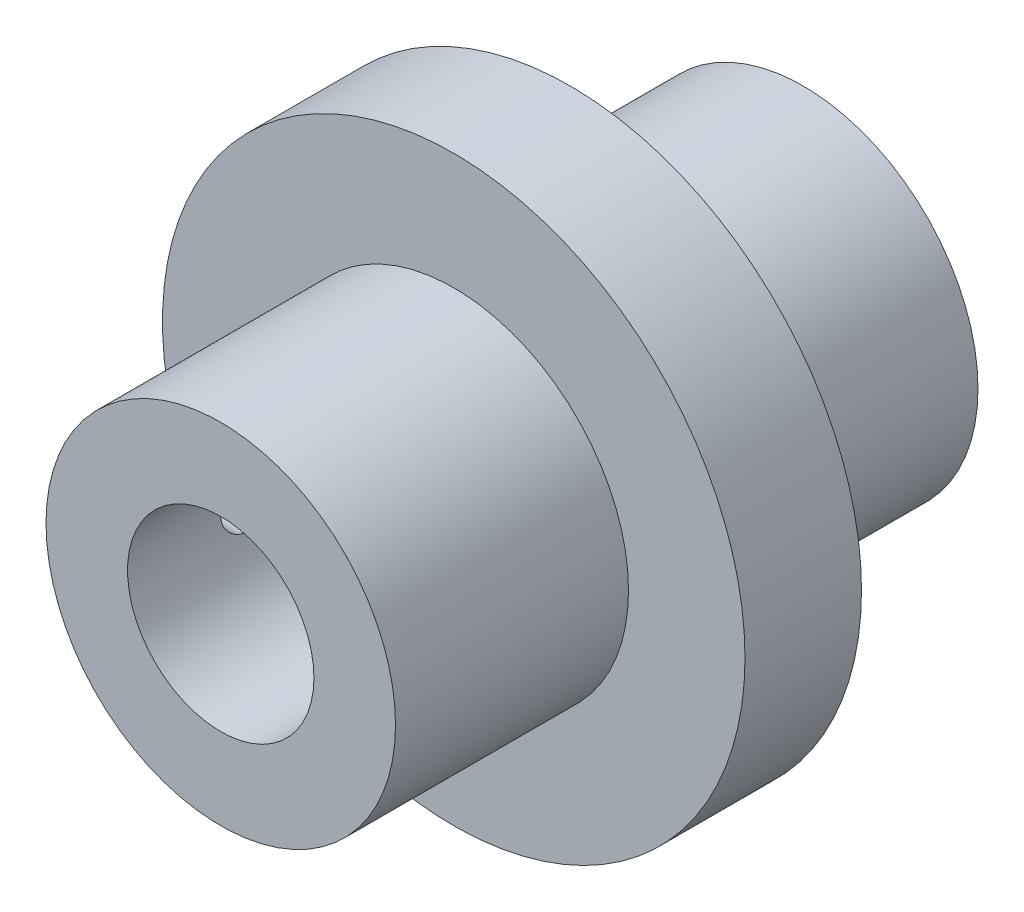
ISO-10303-21;
HEADER;
FILE_DESCRIPTION(('STEP AP214'),'2;1');
FILE_NAME('part.step','',(''),(''),'','','');
FILE_SCHEMA(('AUTOMOTIVE_DESIGN { 1 0 10303 214 1 1 1 1 }'));
ENDSEC;
DATA;
#1=APPLICATION_CONTEXT('core data for automotive mechanical design processes');
#2=APPLICATION_PROTOCOL_DEFINITION('international standard','automotive_design',2000,#1);
#3=PRODUCT_CONTEXT('',#1,'mechanical');
#4=PRODUCT('Part','Part','',(#3));
#5=PRODUCT_RELATED_PRODUCT_CATEGORY('part','',(#4));
#6=PRODUCT_DEFINITION_FORMATION('','',#4);
#7=PRODUCT_DEFINITION_CONTEXT('part definition',#1,'design');
#8=PRODUCT_DEFINITION('design','',#6,#7);
#9=PRODUCT_DEFINITION_SHAPE('','',#8);
#10=(LENGTH_UNIT() NAMED_UNIT(*) SI_UNIT(.MILLI.,.METRE.));
#11=(NAMED_UNIT(*) PLANE_ANGLE_UNIT() SI_UNIT($,.RADIAN.));
#12=(NAMED_UNIT(*) SI_UNIT($,.STERADIAN.) SOLID_ANGLE_UNIT());
#13=UNCERTAINTY_MEASURE_WITH_UNIT(LENGTH_MEASURE(1.E-05),#10,'distance_accuracy_value','');
#14=(GEOMETRIC_REPRESENTATION_CONTEXT(3) GLOBAL_UNCERTAINTY_ASSIGNED_CONTEXT((#13)) GLOBAL_UNIT_ASSIGNED_CONTEXT((#10,
#11,#12)) REPRESENTATION_CONTEXT('',''));
#15=CARTESIAN_POINT('',(0.,0.,0.));
#16=DIRECTION('',(0.,0.,1.));
#17=DIRECTION('',(1.,0.,0.));
#18=AXIS2_PLACEMENT_3D('',#15,#16,#17);
#19=CARTESIAN_POINT('',(0.,0.,15.));
#20=DIRECTION('',(0.,0.,1.));
#21=DIRECTION('',(1.,0.,0.));
#22=AXIS2_PLACEMENT_3D('',#19,#20,#21);
#23=PLANE('',#22);
#24=CARTESIAN_POINT('',(0.,0.,15.));
#25=DIRECTION('',(0.,0.,1.));
#26=DIRECTION('',(1.,0.,0.));
#27=AXIS2_PLACEMENT_3D('',#24,#25,#26);
#28=CIRCLE('',#27,12.5);
#29=CARTESIAN_POINT('',(12.5,0.,15.));
#30=VERTEX_POINT('',#29);
#31=EDGE_CURVE('E55',#30,#30,#28,.T.);
#32=ORIENTED_EDGE('',*,*,#31,.T.);
#33=EDGE_LOOP('',(#32));
#34=FACE_BOUND('',#33,.T.);
#35=CARTESIAN_POINT('',(0.,0.,15.));
#36=DIRECTION('',(0.,0.,1.));
#37=DIRECTION('',(1.,0.,0.));
#38=AXIS2_PLACEMENT_3D('',#35,#36,#37);
#39=CIRCLE('',#38,7.5);
#40=CARTESIAN_POINT('',(7.5,0.,15.));
#41=VERTEX_POINT('',#40);
#42=EDGE_CURVE('E62',#41,#41,#39,.T.);
#43=ORIENTED_EDGE('',*,*,#42,.F.);
#44=EDGE_LOOP('',(#43));
#45=FACE_BOUND('',#44,.T.);
#46=ADVANCED_FACE('F33',(#34,#45),#23,.T.);
#47=CARTESIAN_POINT('',(0.,0.,0.));
#48=DIRECTION('',(0.,0.,1.));
#49=DIRECTION('',(1.,0.,0.));
#50=AXIS2_PLACEMENT_3D('',#47,#48,#49);
#51=PLANE('',#50);
#52=CARTESIAN_POINT('',(0.,0.,0.));
#53=DIRECTION('',(0.,0.,1.));
#54=DIRECTION('',(1.,0.,0.));
#55=AXIS2_PLACEMENT_3D('',#52,#53,#54);
#56=CIRCLE('',#55,7.5);
#57=CARTESIAN_POINT('',(7.5,0.,0.));
#58=VERTEX_POINT('',#57);
#59=EDGE_CURVE('E46',#58,#58,#56,.T.);
#60=ORIENTED_EDGE('',*,*,#59,.F.);
#61=EDGE_LOOP('',(#60));
#62=FACE_BOUND('',#61,.T.);
#63=CARTESIAN_POINT('',(0.,0.,0.));
#64=DIRECTION('',(0.,0.,1.));
#65=DIRECTION('',(1.,0.,0.));
#66=AXIS2_PLACEMENT_3D('',#63,#64,#65);
#67=CIRCLE('',#66,4.);
#68=CARTESIAN_POINT('',(4.,0.,0.));
#69=VERTEX_POINT('',#68);
#70=EDGE_CURVE('E51',#69,#69,#67,.T.);
#71=ORIENTED_EDGE('',*,*,#70,.T.);
#72=EDGE_LOOP('',(#71));
#73=FACE_BOUND('',#72,.T.);
#74=ADVANCED_FACE('F96',(#62,#73),#51,.F.);
#75=CARTESIAN_POINT('',(0.,0.,10.));
#76=DIRECTION('',(0.,0.,-1.));
#77=DIRECTION('',(-1.,0.,0.));
#78=AXIS2_PLACEMENT_3D('',#75,#76,#77);
#79=CYLINDRICAL_SURFACE('',#78,7.5);
#80=CARTESIAN_POINT('',(0.,0.,10.));
#81=DIRECTION('',(0.,0.,1.));
#82=DIRECTION('',(1.,0.,0.));
#83=AXIS2_PLACEMENT_3D('',#80,#81,#82);
#84=CIRCLE('',#83,7.5);
#85=CARTESIAN_POINT('',(7.5,0.,10.));
#86=VERTEX_POINT('',#85);
#87=EDGE_CURVE('E10',#86,#86,#84,.T.);
#88=ORIENTED_EDGE('',*,*,#87,.F.);
#89=EDGE_LOOP('',(#88));
#90=FACE_BOUND('',#89,.T.);
#91=ORIENTED_EDGE('',*,*,#59,.T.);
#92=EDGE_LOOP('',(#91));
#93=FACE_BOUND('',#92,.T.);
#94=ADVANCED_FACE('F35',(#90,#93),#79,.T.);
#95=CARTESIAN_POINT('',(0.,0.,10.));
#96=DIRECTION('',(0.,0.,-1.));
#97=DIRECTION('',(-1.,0.,0.));
#98=AXIS2_PLACEMENT_3D('',#95,#96,#97);
#99=CYLINDRICAL_SURFACE('',#98,4.);
#100=CARTESIAN_POINT('',(-4.,0.,21.));
#101=CARTESIAN_POINT('',(-3.99999906578675,-0.0552507257798208,20.9999984495079));
#102=CARTESIAN_POINT('',(-3.99884385421219,-0.110518771887176,20.9954056328175));
#103=CARTESIAN_POINT('',(-3.99434742553261,-0.219470882513689,20.977183232462));
#104=CARTESIAN_POINT('',(-3.99100496946645,-0.27315403124716,20.9635485269748));
#105=CARTESIAN_POINT('',(-3.98250417554693,-0.377347248121719,20.9277071643586));
#106=CARTESIAN_POINT('',(-3.97734801894724,-0.427861042286669,20.9055108008565));
#107=CARTESIAN_POINT('',(-3.96576895871728,-0.524448087936286,20.8532124066368));
#108=CARTESIAN_POINT('',(-3.95934601236033,-0.570521189565841,20.823110109254));
#109=CARTESIAN_POINT('',(-3.94578275727867,-0.657867951533949,20.7551994735639));
#110=CARTESIAN_POINT('',(-3.93863138099022,-0.699037126707384,20.7172589500272));
#111=CARTESIAN_POINT('',(-3.92449080078353,-0.774499284802206,20.6350318633941));
#112=CARTESIAN_POINT('',(-3.91750161525565,-0.808791491299426,20.5907445847023));
#113=CARTESIAN_POINT('',(-3.9043651713314,-0.870017695199357,20.4962698488417));
#114=CARTESIAN_POINT('',(-3.89823196313737,-0.896834810616906,20.4460045127931));
#115=CARTESIAN_POINT('',(-3.88766329874815,-0.941597939033686,20.3415010588944));
#116=CARTESIAN_POINT('',(-3.88322757115192,-0.959545370292891,20.2872635777828));
#117=CARTESIAN_POINT('',(-3.87666984478367,-0.985703224536197,20.1775043345317));
#118=CARTESIAN_POINT('',(-3.87450327383617,-0.994101512222229,20.1220300693001));
#119=CARTESIAN_POINT('',(-3.8725957502516,-1.00150785004524,20.0104209539907));
#120=CARTESIAN_POINT('',(-3.87285440299096,-1.00051742787866,19.9542862128676));
#121=CARTESIAN_POINT('',(-3.87572803664412,-0.989324349759525,19.8443894615037));
#122=CARTESIAN_POINT('',(-3.87828575334586,-0.979345560127018,19.7906029190233));
#123=CARTESIAN_POINT('',(-3.88537806450989,-0.950816124602075,19.6854926327258));
#124=CARTESIAN_POINT('',(-3.88991279980464,-0.932264868046286,19.6341690646473));
#125=CARTESIAN_POINT('',(-3.90050075936124,-0.886926318624773,19.5348413224986));
#126=CARTESIAN_POINT('',(-3.90656884979614,-0.860057778155278,19.4868758854736));
#127=CARTESIAN_POINT('',(-3.91953140564257,-0.798904184009975,19.3960541934954));
#128=CARTESIAN_POINT('',(-3.9264260155649,-0.764617832539232,19.3531988346218));
#129=CARTESIAN_POINT('',(-3.9405058702652,-0.688442283120818,19.2725309228704));
#130=CARTESIAN_POINT('',(-3.94769379651981,-0.646364172110579,19.2348970066258));
#131=CARTESIAN_POINT('',(-3.96137310385857,-0.556407945002472,19.1671858383574));
#132=CARTESIAN_POINT('',(-3.96786446366277,-0.508529651805301,19.1371088171576));
#133=CARTESIAN_POINT('',(-3.97945154729455,-0.408077259120933,19.0852996091837));
#134=CARTESIAN_POINT('',(-3.9845424008515,-0.355487595472421,19.0635964398304));
#135=CARTESIAN_POINT('',(-3.99271944660945,-0.24725067209526,19.0293884628603));
#136=CARTESIAN_POINT('',(-3.99580602226187,-0.191603999433661,19.0168818957212));
#137=CARTESIAN_POINT('',(-3.9995699951425,-0.0803599802600217,19.0016949562941));
#138=CARTESIAN_POINT('',(-4.00030702338852,-0.0247978133254772,18.9987713159498));
#139=CARTESIAN_POINT('',(-3.999458698763,0.0860219165343346,19.0021660013703));
#140=CARTESIAN_POINT('',(-3.99787355494564,0.141279506429726,19.0084834951994));
#141=CARTESIAN_POINT('',(-3.99259720751571,0.249076179184324,19.0299806055943));
#142=CARTESIAN_POINT('',(-3.98893756123874,0.301643412645833,19.0450275089847));
#143=CARTESIAN_POINT('',(-3.97992471089423,0.403504861635004,19.0834047226856));
#144=CARTESIAN_POINT('',(-3.97457133579928,0.452798746021753,19.1067358695421));
#145=CARTESIAN_POINT('',(-3.96262205284207,0.547682089619895,19.1614907525831));
#146=CARTESIAN_POINT('',(-3.95600578244621,0.593190294557216,19.1930507415978));
#147=CARTESIAN_POINT('',(-3.94229672791613,0.67835107576216,19.2631932725313));
#148=CARTESIAN_POINT('',(-3.93520386167803,0.718002639315335,19.3017770264113));
#149=CARTESIAN_POINT('',(-3.92112637973847,0.791327045381818,19.3860013072296));
#150=CARTESIAN_POINT('',(-3.91414869458187,0.824829245081353,19.4317918020016));
#151=CARTESIAN_POINT('',(-3.90128585584826,0.883673839341797,19.5284884229771));
#152=CARTESIAN_POINT('',(-3.89540065378017,0.90901659610529,19.5793943219732));
#153=CARTESIAN_POINT('',(-3.88545396489777,0.950634280406193,19.6846038149421));
#154=CARTESIAN_POINT('',(-3.88138170194604,0.966962931102708,19.7388850855627));
#155=CARTESIAN_POINT('',(-3.87551162726789,0.990230439969184,19.8495397585927));
#156=CARTESIAN_POINT('',(-3.87371331813291,0.997171351652437,19.9059127006883));
#157=CARTESIAN_POINT('',(-3.87263267469304,1.00135906022266,20.0174140159035));
#158=CARTESIAN_POINT('',(-3.87327955152176,0.998878598520078,20.0725316234165));
#159=CARTESIAN_POINT('',(-3.87685272671895,0.98491818554191,20.1815359257787));
#160=CARTESIAN_POINT('',(-3.87977897927904,0.973438415124512,20.2354226453424));
#161=CARTESIAN_POINT('',(-3.88754173788482,0.941954212961862,20.3401389727103));
#162=CARTESIAN_POINT('',(-3.89236676824206,0.922000936453583,20.3909848701601));
#163=CARTESIAN_POINT('',(-3.90338503816552,0.874176609070046,20.4886435884758));
#164=CARTESIAN_POINT('',(-3.90957846747182,0.846304460022792,20.5354558487913));
#165=CARTESIAN_POINT('',(-3.92283756175675,0.782578499091425,20.6250364193347));
#166=CARTESIAN_POINT('',(-3.92992176554505,0.746535441941504,20.6676673822826));
#167=CARTESIAN_POINT('',(-3.94405351497524,0.667859580793157,20.7463646965303));
#168=CARTESIAN_POINT('',(-3.95110105151373,0.625225214174096,20.782429486742));
#169=CARTESIAN_POINT('',(-3.96451770431775,0.533645057801726,20.8476075390431));
#170=CARTESIAN_POINT('',(-3.97087222243912,0.484598948210924,20.8765830757811));
#171=CARTESIAN_POINT('',(-3.98203283316745,0.382177373006984,20.9258316419604));
#172=CARTESIAN_POINT('',(-3.98684003466521,0.32880504229116,20.946110907099));
#173=CARTESIAN_POINT('',(-3.99365373043694,0.229606835495648,20.9743812202198));
#174=CARTESIAN_POINT('',(-3.9960172336846,0.184253447272046,20.983967495369));
#175=CARTESIAN_POINT('',(-3.99919070154632,0.0926040476908555,20.996777295748));
#176=CARTESIAN_POINT('',(-4.00000078300596,0.0463081074950776,21.0000012995369));
#177=CARTESIAN_POINT('',(-4.,0.,21.));
#178=B_SPLINE_CURVE_WITH_KNOTS('',3,(#100,#101,#102,#103,#104,#105,#106,#107,#108,#109,#110,
#111,#112,#113,#114,#115,#116,#117,#118,#119,#120,#121,#122,#123,#124,#125,#126,#127,#128,#129,
#130,#131,#132,#133,#134,#135,#136,#137,#138,#139,#140,#141,#142,#143,#144,#145,#146,#147,#148,
#149,#150,#151,#152,#153,#154,#155,#156,#157,#158,#159,#160,#161,#162,#163,#164,#165,#166,#167,
#168,#169,#170,#171,#172,#173,#174,#175,#176,#177),.UNSPECIFIED.,.T.,.F.,(4,2,2,2,2,2,2,2,2,2,2,
2,2,2,2,2,2,2,2,2,2,2,2,2,2,2,2,2,2,2,2,2,2,2,2,2,2,2,4),(0.,0.16558247498126,0.331258825175934,
0.496736601524071,0.662219960112888,0.830762902914264,0.999324863867079,1.17039098363871,
1.34142974112912,1.50904196732954,1.67662692075132,1.84014998004679,2.00368468977359,
2.16887018582587,2.33408460557442,2.50401000646013,2.67394059705498,2.84445486006076,
3.01493649125762,3.18105539299518,3.34715934075162,3.51080183009359,3.67446084881527,
3.84102391710235,4.0076157533868,4.17829672802985,4.34897012499673,4.51861503076025,
4.68822282168273,4.85295853599076,5.01769093970691,5.18144267039632,5.34521712091268,
5.51326384273274,5.68135046513613,5.85248123666393,6.02348909214234,6.16228161961433,
6.30106370695361),.UNSPECIFIED.);
#179=CARTESIAN_POINT('',(-4.,0.,21.));
#180=VERTEX_POINT('',#179);
#181=EDGE_CURVE('E70',#180,#180,#178,.T.);
#182=ORIENTED_EDGE('',*,*,#181,.F.);
#183=EDGE_LOOP('',(#182));
#184=FACE_BOUND('',#183,.T.);
#185=ORIENTED_EDGE('',*,*,#70,.F.);
#186=EDGE_LOOP('',(#185));
#187=FACE_BOUND('',#186,.T.);
#188=CARTESIAN_POINT('',(0.,0.,25.));
#189=DIRECTION('',(0.,0.,1.));
#190=DIRECTION('',(1.,0.,0.));
#191=AXIS2_PLACEMENT_3D('',#188,#189,#190);
#192=CIRCLE('',#191,4.);
#193=CARTESIAN_POINT('',(4.,0.,25.));
#194=VERTEX_POINT('',#193);
#195=EDGE_CURVE('E65',#194,#194,#192,.T.);
#196=ORIENTED_EDGE('',*,*,#195,.T.);
#197=EDGE_LOOP('',(#196));
#198=FACE_BOUND('',#197,.T.);
#199=ADVANCED_FACE('F76',(#184,#187,#198),#99,.F.);
#200=CARTESIAN_POINT('',(0.,0.,10.));
#201=DIRECTION('',(0.,0.,1.));
#202=DIRECTION('',(1.,0.,0.));
#203=AXIS2_PLACEMENT_3D('',#200,#201,#202);
#204=PLANE('',#203);
#205=ORIENTED_EDGE('',*,*,#87,.T.);
#206=EDGE_LOOP('',(#205));
#207=FACE_BOUND('',#206,.T.);
#208=CARTESIAN_POINT('',(0.,0.,10.));
#209=DIRECTION('',(0.,0.,1.));
#210=DIRECTION('',(1.,0.,0.));
#211=AXIS2_PLACEMENT_3D('',#208,#209,#210);
#212=CIRCLE('',#211,12.5);
#213=CARTESIAN_POINT('',(12.5,0.,10.));
#214=VERTEX_POINT('',#213);
#215=EDGE_CURVE('E56',#214,#214,#212,.T.);
#216=ORIENTED_EDGE('',*,*,#215,.F.);
#217=EDGE_LOOP('',(#216));
#218=FACE_BOUND('',#217,.T.);
#219=ADVANCED_FACE('F98',(#207,#218),#204,.F.);
#220=CARTESIAN_POINT('',(0.,0.,15.));
#221=DIRECTION('',(0.,0.,-1.));
#222=DIRECTION('',(-1.,0.,0.));
#223=AXIS2_PLACEMENT_3D('',#220,#221,#222);
#224=CYLINDRICAL_SURFACE('',#223,12.5);
#225=ORIENTED_EDGE('',*,*,#31,.F.);
#226=EDGE_LOOP('',(#225));
#227=FACE_BOUND('',#226,.T.);
#228=ORIENTED_EDGE('',*,*,#215,.T.);
#229=EDGE_LOOP('',(#228));
#230=FACE_BOUND('',#229,.T.);
#231=ADVANCED_FACE('F88',(#227,#230),#224,.T.);
#232=CARTESIAN_POINT('',(0.,0.,25.));
#233=DIRECTION('',(0.,0.,1.));
#234=DIRECTION('',(1.,0.,0.));
#235=AXIS2_PLACEMENT_3D('',#232,#233,#234);
#236=PLANE('',#235);
#237=CARTESIAN_POINT('',(0.,0.,25.));
#238=DIRECTION('',(0.,0.,1.));
#239=DIRECTION('',(1.,0.,0.));
#240=AXIS2_PLACEMENT_3D('',#237,#238,#239);
#241=CIRCLE('',#240,7.5);
#242=CARTESIAN_POINT('',(7.5,0.,25.));
#243=VERTEX_POINT('',#242);
#244=EDGE_CURVE('E59',#243,#243,#241,.T.);
#245=ORIENTED_EDGE('',*,*,#244,.T.);
#246=EDGE_LOOP('',(#245));
#247=FACE_BOUND('',#246,.T.);
#248=ORIENTED_EDGE('',*,*,#195,.F.);
#249=EDGE_LOOP('',(#248));
#250=FACE_BOUND('',#249,.T.);
#251=ADVANCED_FACE('F85',(#247,#250),#236,.T.);
#252=CARTESIAN_POINT('',(0.,0.,25.));
#253=DIRECTION('',(0.,0.,-1.));
#254=DIRECTION('',(-1.,0.,0.));
#255=AXIS2_PLACEMENT_3D('',#252,#253,#254);
#256=CYLINDRICAL_SURFACE('',#255,7.5);
#257=CARTESIAN_POINT('',(-7.5,0.,21.));
#258=CARTESIAN_POINT('',(-7.49999917871272,-0.0559044178346424,20.9999976451465));
#259=CARTESIAN_POINT('',(-7.49936835363597,-0.11184298963814,20.9952962310188));
#260=CARTESIAN_POINT('',(-7.49691255563452,-0.22216136256904,20.9766168254752));
#261=CARTESIAN_POINT('',(-7.49508636220862,-0.276539511166519,20.9626293525514));
#262=CARTESIAN_POINT('',(-7.49044539924533,-0.382124156313493,20.9257991412293));
#263=CARTESIAN_POINT('',(-7.48763132105486,-0.433332841529249,20.9029625944808));
#264=CARTESIAN_POINT('',(-7.48132693330196,-0.531181947515152,20.8490965430969));
#265=CARTESIAN_POINT('',(-7.47783673279283,-0.577823103168515,20.8180683594168));
#266=CARTESIAN_POINT('',(-7.47054497394982,-0.665512911252342,20.7484933691979));
#267=CARTESIAN_POINT('',(-7.46674179081055,-0.706528992747934,20.7099056774958));
#268=CARTESIAN_POINT('',(-7.45926568778975,-0.78152367836551,20.6263949054617));
#269=CARTESIAN_POINT('',(-7.45559277481171,-0.815501909986108,20.5814714900021));
#270=CARTESIAN_POINT('',(-7.44877717720095,-0.87557951134454,20.4863504385275));
#271=CARTESIAN_POINT('',(-7.44563658882881,-0.901648037412893,20.4361331587607));
#272=CARTESIAN_POINT('',(-7.44026293689616,-0.944969225036455,20.3319844663816));
#273=CARTESIAN_POINT('',(-7.43802983425604,-0.962222266226393,20.2780532138233));
#274=CARTESIAN_POINT('',(-7.43473968284334,-0.987323033860873,20.1683470947492));
#275=CARTESIAN_POINT('',(-7.43367572685068,-0.995226021142536,20.1125850827335));
#276=CARTESIAN_POINT('',(-7.43282325804657,-1.00157340274059,20.000516910197));
#277=CARTESIAN_POINT('',(-7.433034687102,-1.00001822816801,19.9442107745946));
#278=CARTESIAN_POINT('',(-7.43470277886495,-0.987538729696176,19.833039434986));
#279=CARTESIAN_POINT('',(-7.43615132311171,-0.976675487658812,19.7781672350571));
#280=CARTESIAN_POINT('',(-7.44011776387373,-0.945983623171861,19.67103158162));
#281=CARTESIAN_POINT('',(-7.44263568477064,-0.92615479630729,19.6187681876225));
#282=CARTESIAN_POINT('',(-7.44846630555513,-0.87802964571596,19.5181451826464));
#283=CARTESIAN_POINT('',(-7.45178147061949,-0.84970698956875,19.4697983144028));
#284=CARTESIAN_POINT('',(-7.45883118109967,-0.78541696672145,19.3785204590412));
#285=CARTESIAN_POINT('',(-7.46256574831765,-0.749449202511929,19.3355897537229));
#286=CARTESIAN_POINT('',(-7.47006949616793,-0.670552450131816,19.2560084937091));
#287=CARTESIAN_POINT('',(-7.47383871770599,-0.627570853513228,19.2194100786488));
#288=CARTESIAN_POINT('',(-7.48095961909131,-0.536047085066708,19.1539389775358));
#289=CARTESIAN_POINT('',(-7.48431129773577,-0.487504897221189,19.1250663137382));
#290=CARTESIAN_POINT('',(-7.49022196871789,-0.386196109865238,19.0758654411526));
#291=CARTESIAN_POINT('',(-7.49278063604478,-0.333427789420618,19.0555407344768));
#292=CARTESIAN_POINT('',(-7.49681412952036,-0.225185462168128,19.0240553405138));
#293=CARTESIAN_POINT('',(-7.49828901344964,-0.169711599771132,19.0128941646803));
#294=CARTESIAN_POINT('',(-7.49998120688428,-0.0580834516628256,19.0001207836144));
#295=CARTESIAN_POINT('',(-7.50020796924523,-0.00193751727352473,18.9984367991083));
#296=CARTESIAN_POINT('',(-7.49940395769259,0.109835808609356,19.0044758320636));
#297=CARTESIAN_POINT('',(-7.498373214343,0.165463212672829,19.0121986208912));
#298=CARTESIAN_POINT('',(-7.49517587679051,0.274406857786466,19.036772326692));
#299=CARTESIAN_POINT('',(-7.49301357151461,0.32773100825602,19.0535887841611));
#300=CARTESIAN_POINT('',(-7.48779504627144,0.430802549396778,19.0958364829685));
#301=CARTESIAN_POINT('',(-7.4847387921972,0.480549803507816,19.1212680530066));
#302=CARTESIAN_POINT('',(-7.47804918685037,0.575374439308036,19.1801960777917));
#303=CARTESIAN_POINT('',(-7.47441257522858,0.620422907198299,19.2137386828567));
#304=CARTESIAN_POINT('',(-7.46697864354991,0.704276473495946,19.2878716646121));
#305=CARTESIAN_POINT('',(-7.4631813162031,0.74308128831189,19.3284623612582));
#306=CARTESIAN_POINT('',(-7.45582451236755,0.813602747115488,19.4158565713198));
#307=CARTESIAN_POINT('',(-7.45226674387649,0.845271638044689,19.4626987833691));
#308=CARTESIAN_POINT('',(-7.44582066500909,0.900291755394068,19.5610797051405));
#309=CARTESIAN_POINT('',(-7.44293233968392,0.923643167551731,19.6126183099552));
#310=CARTESIAN_POINT('',(-7.43816405890039,0.96128918250373,19.7187786210138));
#311=CARTESIAN_POINT('',(-7.43628117116299,0.975610144233976,19.7733908426054));
#312=CARTESIAN_POINT('',(-7.43372874349146,0.994873335719793,19.8842718160644));
#313=CARTESIAN_POINT('',(-7.43305913865671,0.999816067133908,19.9405404791622));
#314=CARTESIAN_POINT('',(-7.43301115647724,1.00017242903095,20.0526617454268));
#315=CARTESIAN_POINT('',(-7.4336226114126,0.995661095972463,20.1085141204821));
#316=CARTESIAN_POINT('',(-7.43604591937099,0.977396883433446,20.2186589375519));
#317=CARTESIAN_POINT('',(-7.43785777194415,0.963644007416342,20.272951380151));
#318=CARTESIAN_POINT('',(-7.44247445136382,0.927311551661035,20.3784218416258));
#319=CARTESIAN_POINT('',(-7.445278813297,0.904736104095205,20.4296013055584));
#320=CARTESIAN_POINT('',(-7.45156522856411,0.851406713798686,20.527457941913));
#321=CARTESIAN_POINT('',(-7.45504729498301,0.820652613152142,20.574135027378));
#322=CARTESIAN_POINT('',(-7.46232983591531,0.751562242547541,20.6620448249642));
#323=CARTESIAN_POINT('',(-7.46613252877041,0.713170136134503,20.7032334738776));
#324=CARTESIAN_POINT('',(-7.47360859500832,0.630010846749117,20.7786116081808));
#325=CARTESIAN_POINT('',(-7.47728193784489,0.585242170364887,20.8127994493751));
#326=CARTESIAN_POINT('',(-7.48410317568764,0.49037649392641,20.8733335692333));
#327=CARTESIAN_POINT('',(-7.48724873213445,0.440257310371982,20.8996453332776));
#328=CARTESIAN_POINT('',(-7.49263660329486,0.336296204793663,20.9434402992725));
#329=CARTESIAN_POINT('',(-7.49487988462156,0.282458339484943,20.9609329543124));
#330=CARTESIAN_POINT('',(-7.49767860871633,0.190294204049208,20.9824740031926));
#331=CARTESIAN_POINT('',(-7.49854481817537,0.152545540977888,20.9890366217618));
#332=CARTESIAN_POINT('',(-7.49970579245385,0.0765365858080551,20.9978004070827));
#333=CARTESIAN_POINT('',(-7.500000562314,0.0382762982256198,21.0000016123068));
#334=CARTESIAN_POINT('',(-7.5,0.,21.));
#335=B_SPLINE_CURVE_WITH_KNOTS('',3,(#257,#258,#259,#260,#261,#262,#263,#264,#265,#266,#267,
#268,#269,#270,#271,#272,#273,#274,#275,#276,#277,#278,#279,#280,#281,#282,#283,#284,#285,#286,
#287,#288,#289,#290,#291,#292,#293,#294,#295,#296,#297,#298,#299,#300,#301,#302,#303,#304,#305,
#306,#307,#308,#309,#310,#311,#312,#313,#314,#315,#316,#317,#318,#319,#320,#321,#322,#323,#324,
#325,#326,#327,#328,#329,#330,#331,#332,#333,#334),.UNSPECIFIED.,.T.,.F.,(4,2,2,2,2,2,2,2,2,2,2,
2,2,2,2,2,2,2,2,2,2,2,2,2,2,2,2,2,2,2,2,2,2,2,2,2,2,2,4),(0.,0.167573425652872,
0.335318215442524,0.502945846413705,0.670546462820175,0.839079892217795,1.00762223952418,
1.17681360755824,1.34599768883103,1.5141767795718,1.68234820462461,1.84942442549022,
2.01650445587926,2.18410791568949,2.35172009221899,2.52065272242425,2.68958583926148,
2.8585881010127,3.02758135195872,3.19529292496031,3.3630004217724,3.53007681698232,
3.69715958751774,3.86521637384942,4.03328079129381,4.20243852267726,4.37159247636525,
4.54025037367728,4.70889924891818,4.87621463748313,5.04352996334373,5.21076701851312,
5.37800730297952,5.54651833917554,5.71506890625581,5.88434763337259,6.0534445249621,
6.16817869523655,6.2829118534272),.UNSPECIFIED.);
#336=CARTESIAN_POINT('',(-7.5,0.,21.));
#337=VERTEX_POINT('',#336);
#338=EDGE_CURVE('E37',#337,#337,#335,.T.);
#339=ORIENTED_EDGE('',*,*,#338,.T.);
#340=EDGE_LOOP('',(#339));
#341=FACE_BOUND('',#340,.T.);
#342=ORIENTED_EDGE('',*,*,#244,.F.);
#343=EDGE_LOOP('',(#342));
#344=FACE_BOUND('',#343,.T.);
#345=ORIENTED_EDGE('',*,*,#42,.T.);
#346=EDGE_LOOP('',(#345));
#347=FACE_BOUND('',#346,.T.);
#348=ADVANCED_FACE('F83',(#341,#344,#347),#256,.T.);
#349=CARTESIAN_POINT('',(-10.,0.,20.));
#350=DIRECTION('',(1.,0.,0.));
#351=DIRECTION('',(0.,0.,-1.));
#352=AXIS2_PLACEMENT_3D('',#349,#350,#351);
#353=CYLINDRICAL_SURFACE('',#352,1.);
#354=ORIENTED_EDGE('',*,*,#181,.T.);
#355=EDGE_LOOP('',(#354));
#356=FACE_BOUND('',#355,.T.);
#357=ORIENTED_EDGE('',*,*,#338,.F.);
#358=EDGE_LOOP('',(#357));
#359=FACE_BOUND('',#358,.T.);
#360=ADVANCED_FACE('F79',(#356,#359),#353,.F.);
#361=CLOSED_SHELL('',(#46,#74,#94,#199,#219,#231,#251,#348,#360));
#362=MANIFOLD_SOLID_BREP('B2',#361);
#363=ADVANCED_BREP_SHAPE_REPRESENTATION('',(#18,#362),#14);
#364=SHAPE_DEFINITION_REPRESENTATION(#9,#363);
ENDSEC;
END-ISO-10303-21;
